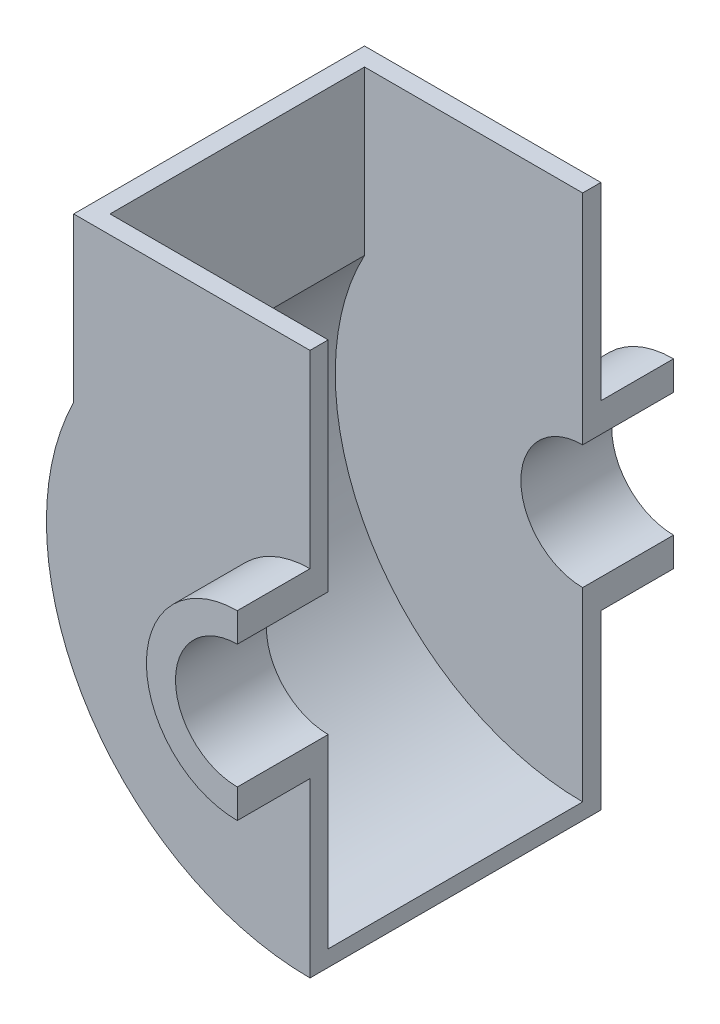
ISO-10303-21;
HEADER;
FILE_DESCRIPTION(('STEP AP214'),'2;1');
FILE_NAME('part.step','',(''),(''),'','','');
FILE_SCHEMA(('AUTOMOTIVE_DESIGN { 1 0 10303 214 1 1 1 1 }'));
ENDSEC;
DATA;
#1=APPLICATION_CONTEXT('core data for automotive mechanical design processes');
#2=APPLICATION_PROTOCOL_DEFINITION('international standard','automotive_design',2000,#1);
#3=PRODUCT_CONTEXT('',#1,'mechanical');
#4=PRODUCT('Part','Part','',(#3));
#5=PRODUCT_RELATED_PRODUCT_CATEGORY('part','',(#4));
#6=PRODUCT_DEFINITION_FORMATION('','',#4);
#7=PRODUCT_DEFINITION_CONTEXT('part definition',#1,'design');
#8=PRODUCT_DEFINITION('design','',#6,#7);
#9=PRODUCT_DEFINITION_SHAPE('','',#8);
#10=(LENGTH_UNIT() NAMED_UNIT(*) SI_UNIT(.MILLI.,.METRE.));
#11=(NAMED_UNIT(*) PLANE_ANGLE_UNIT() SI_UNIT($,.RADIAN.));
#12=(NAMED_UNIT(*) SI_UNIT($,.STERADIAN.) SOLID_ANGLE_UNIT());
#13=UNCERTAINTY_MEASURE_WITH_UNIT(LENGTH_MEASURE(1.E-05),#10,'distance_accuracy_value','');
#14=(GEOMETRIC_REPRESENTATION_CONTEXT(3) GLOBAL_UNCERTAINTY_ASSIGNED_CONTEXT((#13)) GLOBAL_UNIT_ASSIGNED_CONTEXT((#10,
#11,#12)) REPRESENTATION_CONTEXT('',''));
#15=CARTESIAN_POINT('',(0.,0.,0.));
#16=DIRECTION('',(0.,0.,1.));
#17=DIRECTION('',(1.,0.,0.));
#18=AXIS2_PLACEMENT_3D('',#15,#16,#17);
#19=CARTESIAN_POINT('',(0.,0.,-5.));
#20=DIRECTION('',(0.,0.,1.));
#21=DIRECTION('',(1.,0.,0.));
#22=AXIS2_PLACEMENT_3D('',#19,#20,#21);
#23=CYLINDRICAL_SURFACE('',#22,17.);
#24=CARTESIAN_POINT('',(0.,0.,20.));
#25=DIRECTION('',(0.,0.,-1.));
#26=DIRECTION('',(1.,0.,0.));
#27=AXIS2_PLACEMENT_3D('',#24,#25,#26);
#28=CIRCLE('',#27,17.);
#29=CARTESIAN_POINT('',(0.,-17.,20.));
#30=VERTEX_POINT('',#29);
#31=CARTESIAN_POINT('',(0.,17.,20.));
#32=VERTEX_POINT('',#31);
#33=EDGE_CURVE('E248',#30,#32,#28,.T.);
#34=ORIENTED_EDGE('',*,*,#33,.F.);
#35=DIRECTION('',(0.,0.,1.));
#36=VECTOR('',#35,1.);
#37=CARTESIAN_POINT('',(0.,-17.,-5.));
#38=LINE('',#37,#36);
#39=CARTESIAN_POINT('',(0.,-17.,-5.));
#40=VERTEX_POINT('',#39);
#41=EDGE_CURVE('E11',#40,#30,#38,.T.);
#42=ORIENTED_EDGE('',*,*,#41,.F.);
#43=CARTESIAN_POINT('',(0.,0.,-5.));
#44=DIRECTION('',(0.,0.,-1.));
#45=DIRECTION('',(1.,0.,0.));
#46=AXIS2_PLACEMENT_3D('',#43,#44,#45);
#47=CIRCLE('',#46,17.);
#48=CARTESIAN_POINT('',(0.,17.,-5.));
#49=VERTEX_POINT('',#48);
#50=EDGE_CURVE('E260',#40,#49,#47,.T.);
#51=ORIENTED_EDGE('',*,*,#50,.T.);
#52=DIRECTION('',(0.,0.,1.));
#53=VECTOR('',#52,1.);
#54=CARTESIAN_POINT('',(0.,17.,-5.));
#55=LINE('',#54,#53);
#56=EDGE_CURVE('E40',#49,#32,#55,.T.);
#57=ORIENTED_EDGE('',*,*,#56,.T.);
#58=EDGE_LOOP('',(#34,#42,#51,#57));
#59=FACE_BOUND('',#58,.T.);
#60=ADVANCED_FACE('F37',(#59),#23,.F.);
#61=CARTESIAN_POINT('',(0.,-17.,-5.));
#62=DIRECTION('',(1.,0.,0.));
#63=DIRECTION('',(0.,0.,-1.));
#64=AXIS2_PLACEMENT_3D('',#61,#62,#63);
#65=PLANE('',#64);
#66=DIRECTION('',(0.,0.,1.));
#67=VECTOR('',#66,1.);
#68=CARTESIAN_POINT('',(0.,-25.,-5.));
#69=LINE('',#68,#67);
#70=CARTESIAN_POINT('',(0.,-25.,0.));
#71=VERTEX_POINT('',#70);
#72=CARTESIAN_POINT('',(0.,-25.,20.));
#73=VERTEX_POINT('',#72);
#74=EDGE_CURVE('E45',#71,#73,#69,.T.);
#75=ORIENTED_EDGE('',*,*,#74,.F.);
#76=DIRECTION('',(0.,1.,0.));
#77=VECTOR('',#76,1.);
#78=CARTESIAN_POINT('',(0.,-25.,0.));
#79=LINE('',#78,#77);
#80=CARTESIAN_POINT('',(0.,-72.5,0.));
#81=VERTEX_POINT('',#80);
#82=EDGE_CURVE('E228',#81,#71,#79,.T.);
#83=ORIENTED_EDGE('',*,*,#82,.F.);
#84=DIRECTION('',(0.,0.,1.));
#85=VECTOR('',#84,1.);
#86=CARTESIAN_POINT('',(0.,-72.5,-5.));
#87=LINE('',#86,#85);
#88=CARTESIAN_POINT('',(0.,-72.5,-80.));
#89=VERTEX_POINT('',#88);
#90=EDGE_CURVE('E224',#89,#81,#87,.T.);
#91=ORIENTED_EDGE('',*,*,#90,.F.);
#92=DIRECTION('',(0.,1.,0.));
#93=VECTOR('',#92,1.);
#94=CARTESIAN_POINT('',(0.,-25.,-80.));
#95=LINE('',#94,#93);
#96=CARTESIAN_POINT('',(0.,-25.,-80.));
#97=VERTEX_POINT('',#96);
#98=EDGE_CURVE('E303',#89,#97,#95,.T.);
#99=ORIENTED_EDGE('',*,*,#98,.T.);
#100=DIRECTION('',(0.,0.,-1.));
#101=VECTOR('',#100,1.);
#102=CARTESIAN_POINT('',(0.,-25.,-75.));
#103=LINE('',#102,#101);
#104=CARTESIAN_POINT('',(0.,-25.,-100.));
#105=VERTEX_POINT('',#104);
#106=EDGE_CURVE('E198',#97,#105,#103,.T.);
#107=ORIENTED_EDGE('',*,*,#106,.T.);
#108=DIRECTION('',(0.,1.,0.));
#109=VECTOR('',#108,1.);
#110=CARTESIAN_POINT('',(0.,-17.,-100.));
#111=LINE('',#110,#109);
#112=CARTESIAN_POINT('',(0.,-17.,-100.));
#113=VERTEX_POINT('',#112);
#114=EDGE_CURVE('E189',#105,#113,#111,.T.);
#115=ORIENTED_EDGE('',*,*,#114,.T.);
#116=DIRECTION('',(0.,0.,-1.));
#117=VECTOR('',#116,1.);
#118=CARTESIAN_POINT('',(0.,-17.,-75.));
#119=LINE('',#118,#117);
#120=CARTESIAN_POINT('',(0.,-17.,-75.));
#121=VERTEX_POINT('',#120);
#122=EDGE_CURVE('E194',#121,#113,#119,.T.);
#123=ORIENTED_EDGE('',*,*,#122,.F.);
#124=DIRECTION('',(0.,1.,0.));
#125=VECTOR('',#124,1.);
#126=CARTESIAN_POINT('',(0.,-17.,-75.));
#127=LINE('',#126,#125);
#128=CARTESIAN_POINT('',(0.,-68.053287944081,-75.));
#129=VERTEX_POINT('',#128);
#130=EDGE_CURVE('E170',#129,#121,#127,.T.);
#131=ORIENTED_EDGE('',*,*,#130,.F.);
#132=DIRECTION('',(0.,0.,-1.));
#133=VECTOR('',#132,1.);
#134=CARTESIAN_POINT('',(0.,-68.053287944081,161.152038807834));
#135=LINE('',#134,#133);
#136=CARTESIAN_POINT('',(0.,-68.053287944081,-5.));
#137=VERTEX_POINT('',#136);
#138=EDGE_CURVE('E197',#137,#129,#135,.T.);
#139=ORIENTED_EDGE('',*,*,#138,.F.);
#140=DIRECTION('',(0.,1.,0.));
#141=VECTOR('',#140,1.);
#142=CARTESIAN_POINT('',(0.,-17.,-5.));
#143=LINE('',#142,#141);
#144=EDGE_CURVE('E265',#137,#40,#143,.T.);
#145=ORIENTED_EDGE('',*,*,#144,.T.);
#146=ORIENTED_EDGE('',*,*,#41,.T.);
#147=DIRECTION('',(0.,1.,0.));
#148=VECTOR('',#147,1.);
#149=CARTESIAN_POINT('',(0.,-17.,20.));
#150=LINE('',#149,#148);
#151=EDGE_CURVE('E257',#73,#30,#150,.T.);
#152=ORIENTED_EDGE('',*,*,#151,.F.);
#153=EDGE_LOOP('',(#75,#83,#91,#99,#107,#115,#123,#131,#139,#145,#146,#152));
#154=FACE_BOUND('',#153,.T.);
#155=ADVANCED_FACE('F282',(#154),#65,.T.);
#156=CARTESIAN_POINT('',(0.,0.,-5.));
#157=DIRECTION('',(0.,0.,1.));
#158=DIRECTION('',(1.,0.,0.));
#159=AXIS2_PLACEMENT_3D('',#156,#157,#158);
#160=CYLINDRICAL_SURFACE('',#159,25.);
#161=CARTESIAN_POINT('',(0.,0.,0.));
#162=DIRECTION('',(0.,0.,1.));
#163=DIRECTION('',(1.,0.,0.));
#164=AXIS2_PLACEMENT_3D('',#161,#162,#163);
#165=CIRCLE('',#164,25.);
#166=CARTESIAN_POINT('',(0.,25.,0.));
#167=VERTEX_POINT('',#166);
#168=EDGE_CURVE('E61',#71,#167,#165,.F.);
#169=ORIENTED_EDGE('',*,*,#168,.F.);
#170=ORIENTED_EDGE('',*,*,#74,.T.);
#171=CARTESIAN_POINT('',(0.,0.,20.));
#172=DIRECTION('',(0.,0.,1.));
#173=DIRECTION('',(1.,0.,0.));
#174=AXIS2_PLACEMENT_3D('',#171,#172,#173);
#175=CIRCLE('',#174,25.);
#176=CARTESIAN_POINT('',(0.,25.,20.));
#177=VERTEX_POINT('',#176);
#178=EDGE_CURVE('E254',#177,#73,#175,.T.);
#179=ORIENTED_EDGE('',*,*,#178,.F.);
#180=DIRECTION('',(0.,0.,1.));
#181=VECTOR('',#180,1.);
#182=CARTESIAN_POINT('',(0.,25.,-5.));
#183=LINE('',#182,#181);
#184=EDGE_CURVE('E267',#167,#177,#183,.T.);
#185=ORIENTED_EDGE('',*,*,#184,.F.);
#186=EDGE_LOOP('',(#169,#170,#179,#185));
#187=FACE_BOUND('',#186,.T.);
#188=ADVANCED_FACE('F336',(#187),#160,.T.);
#189=CARTESIAN_POINT('',(0.,25.,-5.));
#190=DIRECTION('',(1.,0.,0.));
#191=DIRECTION('',(0.,0.,-1.));
#192=AXIS2_PLACEMENT_3D('',#189,#190,#191);
#193=PLANE('',#192);
#194=DIRECTION('',(0.,1.,0.));
#195=VECTOR('',#194,1.);
#196=CARTESIAN_POINT('',(0.,25.,20.));
#197=LINE('',#196,#195);
#198=EDGE_CURVE('E251',#32,#177,#197,.T.);
#199=ORIENTED_EDGE('',*,*,#198,.F.);
#200=ORIENTED_EDGE('',*,*,#56,.F.);
#201=DIRECTION('',(0.,1.,0.));
#202=VECTOR('',#201,1.);
#203=CARTESIAN_POINT('',(0.,25.,-5.));
#204=LINE('',#203,#202);
#205=CARTESIAN_POINT('',(0.,77.,-5.));
#206=VERTEX_POINT('',#205);
#207=EDGE_CURVE('E263',#49,#206,#204,.T.);
#208=ORIENTED_EDGE('',*,*,#207,.T.);
#209=DIRECTION('',(0.,0.,1.));
#210=VECTOR('',#209,1.);
#211=CARTESIAN_POINT('',(0.,77.,-5.));
#212=LINE('',#211,#210);
#213=CARTESIAN_POINT('',(0.,77.,0.));
#214=VERTEX_POINT('',#213);
#215=EDGE_CURVE('E242',#206,#214,#212,.T.);
#216=ORIENTED_EDGE('',*,*,#215,.T.);
#217=DIRECTION('',(0.,1.,0.));
#218=VECTOR('',#217,1.);
#219=CARTESIAN_POINT('',(0.,25.,0.));
#220=LINE('',#219,#218);
#221=EDGE_CURVE('E231',#167,#214,#220,.T.);
#222=ORIENTED_EDGE('',*,*,#221,.F.);
#223=ORIENTED_EDGE('',*,*,#184,.T.);
#224=EDGE_LOOP('',(#199,#200,#208,#216,#222,#223));
#225=FACE_BOUND('',#224,.T.);
#226=ADVANCED_FACE('F276',(#225),#193,.T.);
#227=CARTESIAN_POINT('',(0.,0.,-5.));
#228=DIRECTION('',(0.,0.,1.));
#229=DIRECTION('',(1.,0.,0.));
#230=AXIS2_PLACEMENT_3D('',#227,#228,#229);
#231=PLANE('',#230);
#232=ORIENTED_EDGE('',*,*,#144,.F.);
#233=CARTESIAN_POINT('',(0.,0.,-5.));
#234=DIRECTION('',(0.,0.,1.));
#235=DIRECTION('',(1.,0.,0.));
#236=AXIS2_PLACEMENT_3D('',#233,#234,#235);
#237=CIRCLE('',#236,68.053287944081);
#238=CARTESIAN_POINT('',(-60.,32.1130814466629,-5.));
#239=VERTEX_POINT('',#238);
#240=EDGE_CURVE('E214',#137,#239,#237,.F.);
#241=ORIENTED_EDGE('',*,*,#240,.T.);
#242=DIRECTION('',(0.,1.,0.));
#243=VECTOR('',#242,1.);
#244=CARTESIAN_POINT('',(-60.,77.,-5.));
#245=LINE('',#244,#243);
#246=CARTESIAN_POINT('',(-60.,77.,-5.));
#247=VERTEX_POINT('',#246);
#248=EDGE_CURVE('E211',#239,#247,#245,.T.);
#249=ORIENTED_EDGE('',*,*,#248,.T.);
#250=DIRECTION('',(-1.,0.,0.));
#251=VECTOR('',#250,1.);
#252=CARTESIAN_POINT('',(0.,77.,-5.));
#253=LINE('',#252,#251);
#254=EDGE_CURVE('E222',#206,#247,#253,.T.);
#255=ORIENTED_EDGE('',*,*,#254,.F.);
#256=ORIENTED_EDGE('',*,*,#207,.F.);
#257=ORIENTED_EDGE('',*,*,#50,.F.);
#258=EDGE_LOOP('',(#232,#241,#249,#255,#256,#257));
#259=FACE_BOUND('',#258,.T.);
#260=ADVANCED_FACE('F286',(#259),#231,.F.);
#261=CARTESIAN_POINT('',(0.,0.,20.));
#262=DIRECTION('',(0.,0.,1.));
#263=DIRECTION('',(1.,0.,0.));
#264=AXIS2_PLACEMENT_3D('',#261,#262,#263);
#265=PLANE('',#264);
#266=ORIENTED_EDGE('',*,*,#33,.T.);
#267=ORIENTED_EDGE('',*,*,#198,.T.);
#268=ORIENTED_EDGE('',*,*,#178,.T.);
#269=ORIENTED_EDGE('',*,*,#151,.T.);
#270=EDGE_LOOP('',(#266,#267,#268,#269));
#271=FACE_BOUND('',#270,.T.);
#272=ADVANCED_FACE('F279',(#271),#265,.T.);
#273=CARTESIAN_POINT('',(0.,0.,-5.));
#274=DIRECTION('',(0.,0.,1.));
#275=DIRECTION('',(1.,0.,0.));
#276=AXIS2_PLACEMENT_3D('',#273,#274,#275);
#277=CYLINDRICAL_SURFACE('',#276,72.5);
#278=CARTESIAN_POINT('',(0.,0.,0.));
#279=DIRECTION('',(0.,0.,1.));
#280=DIRECTION('',(1.,0.,0.));
#281=AXIS2_PLACEMENT_3D('',#278,#279,#280);
#282=CIRCLE('',#281,72.5);
#283=CARTESIAN_POINT('',(-65.,32.1130814466628,0.));
#284=VERTEX_POINT('',#283);
#285=EDGE_CURVE('E213',#284,#81,#282,.T.);
#286=ORIENTED_EDGE('',*,*,#285,.F.);
#287=DIRECTION('',(0.,0.,1.));
#288=VECTOR('',#287,1.);
#289=CARTESIAN_POINT('',(-65.,32.1130814466628,-5.));
#290=LINE('',#289,#288);
#291=CARTESIAN_POINT('',(-65.,32.1130814466628,-80.));
#292=VERTEX_POINT('',#291);
#293=EDGE_CURVE('E238',#292,#284,#290,.T.);
#294=ORIENTED_EDGE('',*,*,#293,.F.);
#295=CARTESIAN_POINT('',(0.,0.,-80.));
#296=DIRECTION('',(0.,0.,1.));
#297=DIRECTION('',(1.,0.,0.));
#298=AXIS2_PLACEMENT_3D('',#295,#296,#297);
#299=CIRCLE('',#298,72.5);
#300=EDGE_CURVE('E305',#292,#89,#299,.T.);
#301=ORIENTED_EDGE('',*,*,#300,.T.);
#302=ORIENTED_EDGE('',*,*,#90,.T.);
#303=EDGE_LOOP('',(#286,#294,#301,#302));
#304=FACE_BOUND('',#303,.T.);
#305=ADVANCED_FACE('F300',(#304),#277,.T.);
#306=CARTESIAN_POINT('',(-65.,77.,-5.));
#307=DIRECTION('',(-1.,0.,0.));
#308=DIRECTION('',(0.,0.,1.));
#309=AXIS2_PLACEMENT_3D('',#306,#307,#308);
#310=PLANE('',#309);
#311=DIRECTION('',(0.,-1.,0.));
#312=VECTOR('',#311,1.);
#313=CARTESIAN_POINT('',(-65.,77.,0.));
#314=LINE('',#313,#312);
#315=CARTESIAN_POINT('',(-65.,77.,0.));
#316=VERTEX_POINT('',#315);
#317=EDGE_CURVE('E225',#316,#284,#314,.T.);
#318=ORIENTED_EDGE('',*,*,#317,.F.);
#319=DIRECTION('',(0.,0.,1.));
#320=VECTOR('',#319,1.);
#321=CARTESIAN_POINT('',(-65.,77.,-5.));
#322=LINE('',#321,#320);
#323=CARTESIAN_POINT('',(-65.,77.,-80.));
#324=VERTEX_POINT('',#323);
#325=EDGE_CURVE('E240',#324,#316,#322,.T.);
#326=ORIENTED_EDGE('',*,*,#325,.F.);
#327=DIRECTION('',(0.,-1.,0.));
#328=VECTOR('',#327,1.);
#329=CARTESIAN_POINT('',(-65.,77.,-80.));
#330=LINE('',#329,#328);
#331=EDGE_CURVE('E160',#324,#292,#330,.T.);
#332=ORIENTED_EDGE('',*,*,#331,.T.);
#333=ORIENTED_EDGE('',*,*,#293,.T.);
#334=EDGE_LOOP('',(#318,#326,#332,#333));
#335=FACE_BOUND('',#334,.T.);
#336=ADVANCED_FACE('F293',(#335),#310,.T.);
#337=CARTESIAN_POINT('',(0.,77.,-5.));
#338=DIRECTION('',(0.,1.,0.));
#339=DIRECTION('',(-1.,0.,0.));
#340=AXIS2_PLACEMENT_3D('',#337,#338,#339);
#341=PLANE('',#340);
#342=DIRECTION('',(-1.,0.,0.));
#343=VECTOR('',#342,1.);
#344=CARTESIAN_POINT('',(0.,77.,0.));
#345=LINE('',#344,#343);
#346=EDGE_CURVE('E233',#214,#316,#345,.T.);
#347=ORIENTED_EDGE('',*,*,#346,.F.);
#348=ORIENTED_EDGE('',*,*,#215,.F.);
#349=ORIENTED_EDGE('',*,*,#254,.T.);
#350=DIRECTION('',(0.,0.,-1.));
#351=VECTOR('',#350,1.);
#352=CARTESIAN_POINT('',(-60.,77.,161.152038807834));
#353=LINE('',#352,#351);
#354=CARTESIAN_POINT('',(-60.,77.,-75.));
#355=VERTEX_POINT('',#354);
#356=EDGE_CURVE('E53',#247,#355,#353,.T.);
#357=ORIENTED_EDGE('',*,*,#356,.T.);
#358=DIRECTION('',(-1.,0.,0.));
#359=VECTOR('',#358,1.);
#360=CARTESIAN_POINT('',(0.,77.,-75.));
#361=LINE('',#360,#359);
#362=CARTESIAN_POINT('',(0.,77.,-75.));
#363=VERTEX_POINT('',#362);
#364=EDGE_CURVE('E150',#363,#355,#361,.T.);
#365=ORIENTED_EDGE('',*,*,#364,.F.);
#366=DIRECTION('',(0.,0.,-1.));
#367=VECTOR('',#366,1.);
#368=CARTESIAN_POINT('',(0.,77.,-75.));
#369=LINE('',#368,#367);
#370=CARTESIAN_POINT('',(0.,77.,-80.));
#371=VERTEX_POINT('',#370);
#372=EDGE_CURVE('E156',#363,#371,#369,.T.);
#373=ORIENTED_EDGE('',*,*,#372,.T.);
#374=DIRECTION('',(-1.,0.,0.));
#375=VECTOR('',#374,1.);
#376=CARTESIAN_POINT('',(0.,77.,-80.));
#377=LINE('',#376,#375);
#378=EDGE_CURVE('E310',#371,#324,#377,.T.);
#379=ORIENTED_EDGE('',*,*,#378,.T.);
#380=ORIENTED_EDGE('',*,*,#325,.T.);
#381=EDGE_LOOP('',(#347,#348,#349,#357,#365,#373,#379,#380));
#382=FACE_BOUND('',#381,.T.);
#383=ADVANCED_FACE('F153',(#382),#341,.T.);
#384=CARTESIAN_POINT('',(0.,0.,0.));
#385=DIRECTION('',(0.,0.,1.));
#386=DIRECTION('',(1.,0.,0.));
#387=AXIS2_PLACEMENT_3D('',#384,#385,#386);
#388=PLANE('',#387);
#389=ORIENTED_EDGE('',*,*,#82,.T.);
#390=ORIENTED_EDGE('',*,*,#168,.T.);
#391=ORIENTED_EDGE('',*,*,#221,.T.);
#392=ORIENTED_EDGE('',*,*,#346,.T.);
#393=ORIENTED_EDGE('',*,*,#317,.T.);
#394=ORIENTED_EDGE('',*,*,#285,.T.);
#395=EDGE_LOOP('',(#389,#390,#391,#392,#393,#394));
#396=FACE_BOUND('',#395,.T.);
#397=ADVANCED_FACE('F291',(#396),#388,.T.);
#398=CARTESIAN_POINT('',(0.,0.,161.152038807834));
#399=DIRECTION('',(0.,0.,-1.));
#400=DIRECTION('',(-1.,0.,0.));
#401=AXIS2_PLACEMENT_3D('',#398,#399,#400);
#402=CYLINDRICAL_SURFACE('',#401,68.053287944081);
#403=ORIENTED_EDGE('',*,*,#240,.F.);
#404=ORIENTED_EDGE('',*,*,#138,.T.);
#405=CARTESIAN_POINT('',(0.,0.,-75.));
#406=DIRECTION('',(0.,0.,-1.));
#407=DIRECTION('',(1.,0.,0.));
#408=AXIS2_PLACEMENT_3D('',#405,#406,#407);
#409=CIRCLE('',#408,68.053287944081);
#410=CARTESIAN_POINT('',(-60.,32.1130814466629,-75.));
#411=VERTEX_POINT('',#410);
#412=EDGE_CURVE('E208',#129,#411,#409,.T.);
#413=ORIENTED_EDGE('',*,*,#412,.T.);
#414=DIRECTION('',(0.,0.,-1.));
#415=VECTOR('',#414,1.);
#416=CARTESIAN_POINT('',(-60.,32.1130814466629,161.152038807834));
#417=LINE('',#416,#415);
#418=EDGE_CURVE('E207',#239,#411,#417,.T.);
#419=ORIENTED_EDGE('',*,*,#418,.F.);
#420=EDGE_LOOP('',(#403,#404,#413,#419));
#421=FACE_BOUND('',#420,.T.);
#422=ADVANCED_FACE('F362',(#421),#402,.F.);
#423=CARTESIAN_POINT('',(-60.,77.,161.152038807834));
#424=DIRECTION('',(-1.,0.,0.));
#425=DIRECTION('',(0.,-1.,0.));
#426=AXIS2_PLACEMENT_3D('',#423,#424,#425);
#427=PLANE('',#426);
#428=ORIENTED_EDGE('',*,*,#248,.F.);
#429=ORIENTED_EDGE('',*,*,#418,.T.);
#430=DIRECTION('',(0.,1.,0.));
#431=VECTOR('',#430,1.);
#432=CARTESIAN_POINT('',(-60.,77.,-75.));
#433=LINE('',#432,#431);
#434=EDGE_CURVE('E205',#411,#355,#433,.T.);
#435=ORIENTED_EDGE('',*,*,#434,.T.);
#436=ORIENTED_EDGE('',*,*,#356,.F.);
#437=EDGE_LOOP('',(#428,#429,#435,#436));
#438=FACE_BOUND('',#437,.T.);
#439=ADVANCED_FACE('F365',(#438),#427,.F.);
#440=CARTESIAN_POINT('',(0.,0.,-75.));
#441=DIRECTION('',(0.,0.,-1.));
#442=DIRECTION('',(1.,0.,0.));
#443=AXIS2_PLACEMENT_3D('',#440,#441,#442);
#444=PLANE('',#443);
#445=ORIENTED_EDGE('',*,*,#434,.F.);
#446=ORIENTED_EDGE('',*,*,#412,.F.);
#447=ORIENTED_EDGE('',*,*,#130,.T.);
#448=CARTESIAN_POINT('',(0.,0.,-75.));
#449=DIRECTION('',(0.,0.,-1.));
#450=DIRECTION('',(1.,0.,0.));
#451=AXIS2_PLACEMENT_3D('',#448,#449,#450);
#452=CIRCLE('',#451,17.);
#453=CARTESIAN_POINT('',(0.,17.,-75.));
#454=VERTEX_POINT('',#453);
#455=EDGE_CURVE('E166',#121,#454,#452,.T.);
#456=ORIENTED_EDGE('',*,*,#455,.T.);
#457=DIRECTION('',(0.,1.,0.));
#458=VECTOR('',#457,1.);
#459=CARTESIAN_POINT('',(0.,25.,-75.));
#460=LINE('',#459,#458);
#461=EDGE_CURVE('E163',#454,#363,#460,.T.);
#462=ORIENTED_EDGE('',*,*,#461,.T.);
#463=ORIENTED_EDGE('',*,*,#364,.T.);
#464=EDGE_LOOP('',(#445,#446,#447,#456,#462,#463));
#465=FACE_BOUND('',#464,.T.);
#466=ADVANCED_FACE('F164',(#465),#444,.F.);
#467=CARTESIAN_POINT('',(0.,0.,-75.));
#468=DIRECTION('',(0.,0.,-1.));
#469=DIRECTION('',(1.,0.,0.));
#470=AXIS2_PLACEMENT_3D('',#467,#468,#469);
#471=CYLINDRICAL_SURFACE('',#470,17.);
#472=CARTESIAN_POINT('',(0.,0.,-100.));
#473=DIRECTION('',(0.,0.,-1.));
#474=DIRECTION('',(1.,0.,0.));
#475=AXIS2_PLACEMENT_3D('',#472,#473,#474);
#476=CIRCLE('',#475,17.);
#477=CARTESIAN_POINT('',(0.,17.,-100.));
#478=VERTEX_POINT('',#477);
#479=EDGE_CURVE('E178',#113,#478,#476,.T.);
#480=ORIENTED_EDGE('',*,*,#479,.T.);
#481=DIRECTION('',(0.,0.,-1.));
#482=VECTOR('',#481,1.);
#483=CARTESIAN_POINT('',(0.,17.,-75.));
#484=LINE('',#483,#482);
#485=EDGE_CURVE('E193',#454,#478,#484,.T.);
#486=ORIENTED_EDGE('',*,*,#485,.F.);
#487=ORIENTED_EDGE('',*,*,#455,.F.);
#488=ORIENTED_EDGE('',*,*,#122,.T.);
#489=EDGE_LOOP('',(#480,#486,#487,#488));
#490=FACE_BOUND('',#489,.T.);
#491=ADVANCED_FACE('F321',(#490),#471,.F.);
#492=CARTESIAN_POINT('',(0.,0.,-75.));
#493=DIRECTION('',(0.,0.,-1.));
#494=DIRECTION('',(1.,0.,0.));
#495=AXIS2_PLACEMENT_3D('',#492,#493,#494);
#496=CYLINDRICAL_SURFACE('',#495,25.);
#497=CARTESIAN_POINT('',(0.,0.,-80.));
#498=DIRECTION('',(0.,0.,1.));
#499=DIRECTION('',(1.,0.,0.));
#500=AXIS2_PLACEMENT_3D('',#497,#498,#499);
#501=CIRCLE('',#500,25.);
#502=CARTESIAN_POINT('',(0.,25.,-80.));
#503=VERTEX_POINT('',#502);
#504=EDGE_CURVE('E175',#97,#503,#501,.F.);
#505=ORIENTED_EDGE('',*,*,#504,.T.);
#506=DIRECTION('',(0.,0.,-1.));
#507=VECTOR('',#506,1.);
#508=CARTESIAN_POINT('',(0.,25.,-75.));
#509=LINE('',#508,#507);
#510=CARTESIAN_POINT('',(0.,25.,-100.));
#511=VERTEX_POINT('',#510);
#512=EDGE_CURVE('E201',#503,#511,#509,.T.);
#513=ORIENTED_EDGE('',*,*,#512,.T.);
#514=CARTESIAN_POINT('',(0.,0.,-100.));
#515=DIRECTION('',(0.,0.,1.));
#516=DIRECTION('',(1.,0.,0.));
#517=AXIS2_PLACEMENT_3D('',#514,#515,#516);
#518=CIRCLE('',#517,25.);
#519=EDGE_CURVE('E187',#511,#105,#518,.T.);
#520=ORIENTED_EDGE('',*,*,#519,.T.);
#521=ORIENTED_EDGE('',*,*,#106,.F.);
#522=EDGE_LOOP('',(#505,#513,#520,#521));
#523=FACE_BOUND('',#522,.T.);
#524=ADVANCED_FACE('F314',(#523),#496,.T.);
#525=CARTESIAN_POINT('',(0.,25.,-75.));
#526=DIRECTION('',(1.,0.,0.));
#527=DIRECTION('',(0.,0.,1.));
#528=AXIS2_PLACEMENT_3D('',#525,#526,#527);
#529=PLANE('',#528);
#530=DIRECTION('',(0.,1.,0.));
#531=VECTOR('',#530,1.);
#532=CARTESIAN_POINT('',(0.,25.,-100.));
#533=LINE('',#532,#531);
#534=EDGE_CURVE('E185',#478,#511,#533,.T.);
#535=ORIENTED_EDGE('',*,*,#534,.T.);
#536=ORIENTED_EDGE('',*,*,#512,.F.);
#537=DIRECTION('',(0.,1.,0.));
#538=VECTOR('',#537,1.);
#539=CARTESIAN_POINT('',(0.,25.,-80.));
#540=LINE('',#539,#538);
#541=EDGE_CURVE('E174',#503,#371,#540,.T.);
#542=ORIENTED_EDGE('',*,*,#541,.T.);
#543=ORIENTED_EDGE('',*,*,#372,.F.);
#544=ORIENTED_EDGE('',*,*,#461,.F.);
#545=ORIENTED_EDGE('',*,*,#485,.T.);
#546=EDGE_LOOP('',(#535,#536,#542,#543,#544,#545));
#547=FACE_BOUND('',#546,.T.);
#548=ADVANCED_FACE('F172',(#547),#529,.T.);
#549=CARTESIAN_POINT('',(0.,0.,-100.));
#550=DIRECTION('',(0.,0.,-1.));
#551=DIRECTION('',(1.,0.,0.));
#552=AXIS2_PLACEMENT_3D('',#549,#550,#551);
#553=PLANE('',#552);
#554=ORIENTED_EDGE('',*,*,#479,.F.);
#555=ORIENTED_EDGE('',*,*,#114,.F.);
#556=ORIENTED_EDGE('',*,*,#519,.F.);
#557=ORIENTED_EDGE('',*,*,#534,.F.);
#558=EDGE_LOOP('',(#554,#555,#556,#557));
#559=FACE_BOUND('',#558,.T.);
#560=ADVANCED_FACE('F322',(#559),#553,.T.);
#561=CARTESIAN_POINT('',(0.,0.,-80.));
#562=DIRECTION('',(0.,0.,-1.));
#563=DIRECTION('',(1.,0.,0.));
#564=AXIS2_PLACEMENT_3D('',#561,#562,#563);
#565=PLANE('',#564);
#566=ORIENTED_EDGE('',*,*,#98,.F.);
#567=ORIENTED_EDGE('',*,*,#300,.F.);
#568=ORIENTED_EDGE('',*,*,#331,.F.);
#569=ORIENTED_EDGE('',*,*,#378,.F.);
#570=ORIENTED_EDGE('',*,*,#541,.F.);
#571=ORIENTED_EDGE('',*,*,#504,.F.);
#572=EDGE_LOOP('',(#566,#567,#568,#569,#570,#571));
#573=FACE_BOUND('',#572,.T.);
#574=ADVANCED_FACE('F308',(#573),#565,.T.);
#575=CLOSED_SHELL('',(#60,#155,#188,#226,#260,#272,#305,#336,#383,#397,#422,#439,#466,#491,#524,
#548,#560,#574));
#576=MANIFOLD_SOLID_BREP('B2',#575);
#577=ADVANCED_BREP_SHAPE_REPRESENTATION('',(#18,#576),#14);
#578=SHAPE_DEFINITION_REPRESENTATION(#9,#577);
ENDSEC;
END-ISO-10303-21;
